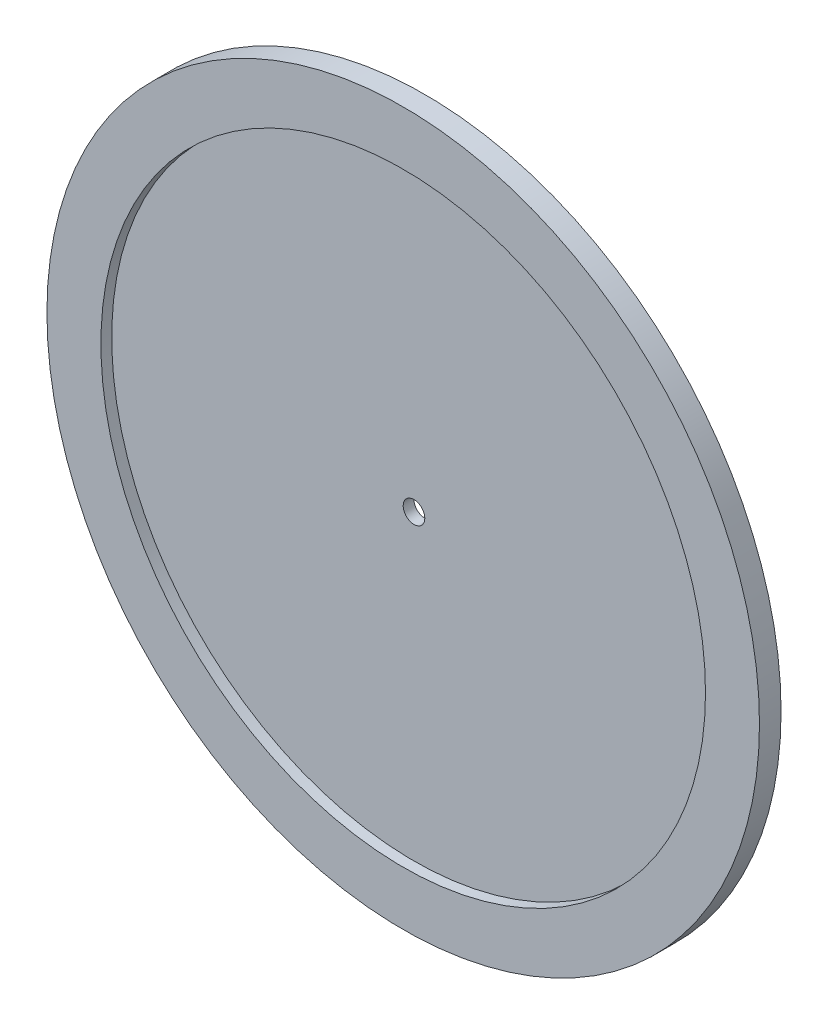
ISO-10303-21;
HEADER;
FILE_DESCRIPTION(('STEP AP214'),'2;1');
FILE_NAME('part.step','',(''),(''),'','','');
FILE_SCHEMA(('AUTOMOTIVE_DESIGN { 1 0 10303 214 1 1 1 1 }'));
ENDSEC;
DATA;
#1=APPLICATION_CONTEXT('core data for automotive mechanical design processes');
#2=APPLICATION_PROTOCOL_DEFINITION('international standard','automotive_design',2000,#1);
#3=PRODUCT_CONTEXT('',#1,'mechanical');
#4=PRODUCT('Part','Part','',(#3));
#5=PRODUCT_RELATED_PRODUCT_CATEGORY('part','',(#4));
#6=PRODUCT_DEFINITION_FORMATION('','',#4);
#7=PRODUCT_DEFINITION_CONTEXT('part definition',#1,'design');
#8=PRODUCT_DEFINITION('design','',#6,#7);
#9=PRODUCT_DEFINITION_SHAPE('','',#8);
#10=(LENGTH_UNIT() NAMED_UNIT(*) SI_UNIT(.MILLI.,.METRE.));
#11=(NAMED_UNIT(*) PLANE_ANGLE_UNIT() SI_UNIT($,.RADIAN.));
#12=(NAMED_UNIT(*) SI_UNIT($,.STERADIAN.) SOLID_ANGLE_UNIT());
#13=UNCERTAINTY_MEASURE_WITH_UNIT(LENGTH_MEASURE(1.E-05),#10,'distance_accuracy_value','');
#14=(GEOMETRIC_REPRESENTATION_CONTEXT(3) GLOBAL_UNCERTAINTY_ASSIGNED_CONTEXT((#13)) GLOBAL_UNIT_ASSIGNED_CONTEXT((#10,
#11,#12)) REPRESENTATION_CONTEXT('',''));
#15=CARTESIAN_POINT('',(0.,0.,0.));
#16=DIRECTION('',(0.,0.,1.));
#17=DIRECTION('',(1.,0.,0.));
#18=AXIS2_PLACEMENT_3D('',#15,#16,#17);
#19=CARTESIAN_POINT('',(0.,0.,0.));
#20=DIRECTION('',(0.,0.,1.));
#21=DIRECTION('',(1.,0.,0.));
#22=AXIS2_PLACEMENT_3D('',#19,#20,#21);
#23=CYLINDRICAL_SURFACE('',#22,3.175);
#24=CARTESIAN_POINT('',(0.,0.,0.));
#25=DIRECTION('',(0.,0.,1.));
#26=DIRECTION('',(1.,0.,0.));
#27=AXIS2_PLACEMENT_3D('',#24,#25,#26);
#28=CIRCLE('',#27,3.175);
#29=CARTESIAN_POINT('',(3.175,0.,0.));
#30=VERTEX_POINT('',#29);
#31=EDGE_CURVE('E42',#30,#30,#28,.T.);
#32=ORIENTED_EDGE('',*,*,#31,.F.);
#33=EDGE_LOOP('',(#32));
#34=FACE_BOUND('',#33,.T.);
#35=CARTESIAN_POINT('',(0.,0.,3.175));
#36=DIRECTION('',(0.,0.,1.));
#37=DIRECTION('',(1.,0.,0.));
#38=AXIS2_PLACEMENT_3D('',#35,#36,#37);
#39=CIRCLE('',#38,3.175);
#40=CARTESIAN_POINT('',(3.175,0.,3.175));
#41=VERTEX_POINT('',#40);
#42=EDGE_CURVE('E33',#41,#41,#39,.F.);
#43=ORIENTED_EDGE('',*,*,#42,.F.);
#44=EDGE_LOOP('',(#43));
#45=FACE_BOUND('',#44,.T.);
#46=ADVANCED_FACE('F29',(#34,#45),#23,.F.);
#47=CARTESIAN_POINT('',(0.,0.,6.35));
#48=DIRECTION('',(0.,0.,-1.));
#49=DIRECTION('',(-1.,0.,0.));
#50=AXIS2_PLACEMENT_3D('',#47,#48,#49);
#51=CYLINDRICAL_SURFACE('',#50,104.775);
#52=CARTESIAN_POINT('',(0.,0.,6.35));
#53=DIRECTION('',(0.,0.,1.));
#54=DIRECTION('',(1.,0.,0.));
#55=AXIS2_PLACEMENT_3D('',#52,#53,#54);
#56=CIRCLE('',#55,104.775);
#57=CARTESIAN_POINT('',(104.775,0.,6.35));
#58=VERTEX_POINT('',#57);
#59=EDGE_CURVE('E10',#58,#58,#56,.T.);
#60=ORIENTED_EDGE('',*,*,#59,.F.);
#61=EDGE_LOOP('',(#60));
#62=FACE_BOUND('',#61,.T.);
#63=CARTESIAN_POINT('',(0.,0.,0.));
#64=DIRECTION('',(0.,0.,1.));
#65=DIRECTION('',(1.,0.,0.));
#66=AXIS2_PLACEMENT_3D('',#63,#64,#65);
#67=CIRCLE('',#66,104.775);
#68=CARTESIAN_POINT('',(104.775,0.,0.));
#69=VERTEX_POINT('',#68);
#70=EDGE_CURVE('E37',#69,#69,#67,.T.);
#71=ORIENTED_EDGE('',*,*,#70,.T.);
#72=EDGE_LOOP('',(#71));
#73=FACE_BOUND('',#72,.T.);
#74=ADVANCED_FACE('F31',(#62,#73),#51,.T.);
#75=CARTESIAN_POINT('',(0.,0.,6.35));
#76=DIRECTION('',(0.,0.,1.));
#77=DIRECTION('',(1.,0.,0.));
#78=AXIS2_PLACEMENT_3D('',#75,#76,#77);
#79=PLANE('',#78);
#80=CARTESIAN_POINT('',(0.,0.,6.35));
#81=DIRECTION('',(0.,0.,1.));
#82=DIRECTION('',(1.,0.,0.));
#83=AXIS2_PLACEMENT_3D('',#80,#81,#82);
#84=CIRCLE('',#83,88.9);
#85=CARTESIAN_POINT('',(88.9,0.,6.35));
#86=VERTEX_POINT('',#85);
#87=EDGE_CURVE('E46',#86,#86,#84,.T.);
#88=ORIENTED_EDGE('',*,*,#87,.F.);
#89=EDGE_LOOP('',(#88));
#90=FACE_BOUND('',#89,.T.);
#91=ORIENTED_EDGE('',*,*,#59,.T.);
#92=EDGE_LOOP('',(#91));
#93=FACE_BOUND('',#92,.T.);
#94=ADVANCED_FACE('F64',(#90,#93),#79,.T.);
#95=CARTESIAN_POINT('',(0.,0.,0.));
#96=DIRECTION('',(0.,0.,1.));
#97=DIRECTION('',(1.,0.,0.));
#98=AXIS2_PLACEMENT_3D('',#95,#96,#97);
#99=PLANE('',#98);
#100=ORIENTED_EDGE('',*,*,#31,.T.);
#101=EDGE_LOOP('',(#100));
#102=FACE_BOUND('',#101,.T.);
#103=ORIENTED_EDGE('',*,*,#70,.F.);
#104=EDGE_LOOP('',(#103));
#105=FACE_BOUND('',#104,.T.);
#106=ADVANCED_FACE('F72',(#102,#105),#99,.F.);
#107=CARTESIAN_POINT('',(0.,0.,3.175));
#108=DIRECTION('',(0.,0.,1.));
#109=DIRECTION('',(1.,0.,0.));
#110=AXIS2_PLACEMENT_3D('',#107,#108,#109);
#111=PLANE('',#110);
#112=CARTESIAN_POINT('',(0.,0.,3.175));
#113=DIRECTION('',(0.,0.,1.));
#114=DIRECTION('',(1.,0.,0.));
#115=AXIS2_PLACEMENT_3D('',#112,#113,#114);
#116=CIRCLE('',#115,88.9);
#117=CARTESIAN_POINT('',(88.9,0.,3.175));
#118=VERTEX_POINT('',#117);
#119=EDGE_CURVE('E49',#118,#118,#116,.T.);
#120=ORIENTED_EDGE('',*,*,#119,.T.);
#121=EDGE_LOOP('',(#120));
#122=FACE_BOUND('',#121,.T.);
#123=ORIENTED_EDGE('',*,*,#42,.T.);
#124=EDGE_LOOP('',(#123));
#125=FACE_BOUND('',#124,.T.);
#126=ADVANCED_FACE('F56',(#122,#125),#111,.T.);
#127=CARTESIAN_POINT('',(0.,0.,3.175));
#128=DIRECTION('',(0.,0.,1.));
#129=DIRECTION('',(1.,0.,0.));
#130=AXIS2_PLACEMENT_3D('',#127,#128,#129);
#131=CYLINDRICAL_SURFACE('',#130,88.9);
#132=ORIENTED_EDGE('',*,*,#119,.F.);
#133=EDGE_LOOP('',(#132));
#134=FACE_BOUND('',#133,.T.);
#135=ORIENTED_EDGE('',*,*,#87,.T.);
#136=EDGE_LOOP('',(#135));
#137=FACE_BOUND('',#136,.T.);
#138=ADVANCED_FACE('F69',(#134,#137),#131,.F.);
#139=CLOSED_SHELL('',(#46,#74,#94,#106,#126,#138));
#140=MANIFOLD_SOLID_BREP('B2',#139);
#141=ADVANCED_BREP_SHAPE_REPRESENTATION('',(#18,#140),#14);
#142=SHAPE_DEFINITION_REPRESENTATION(#9,#141);
ENDSEC;
END-ISO-10303-21;
